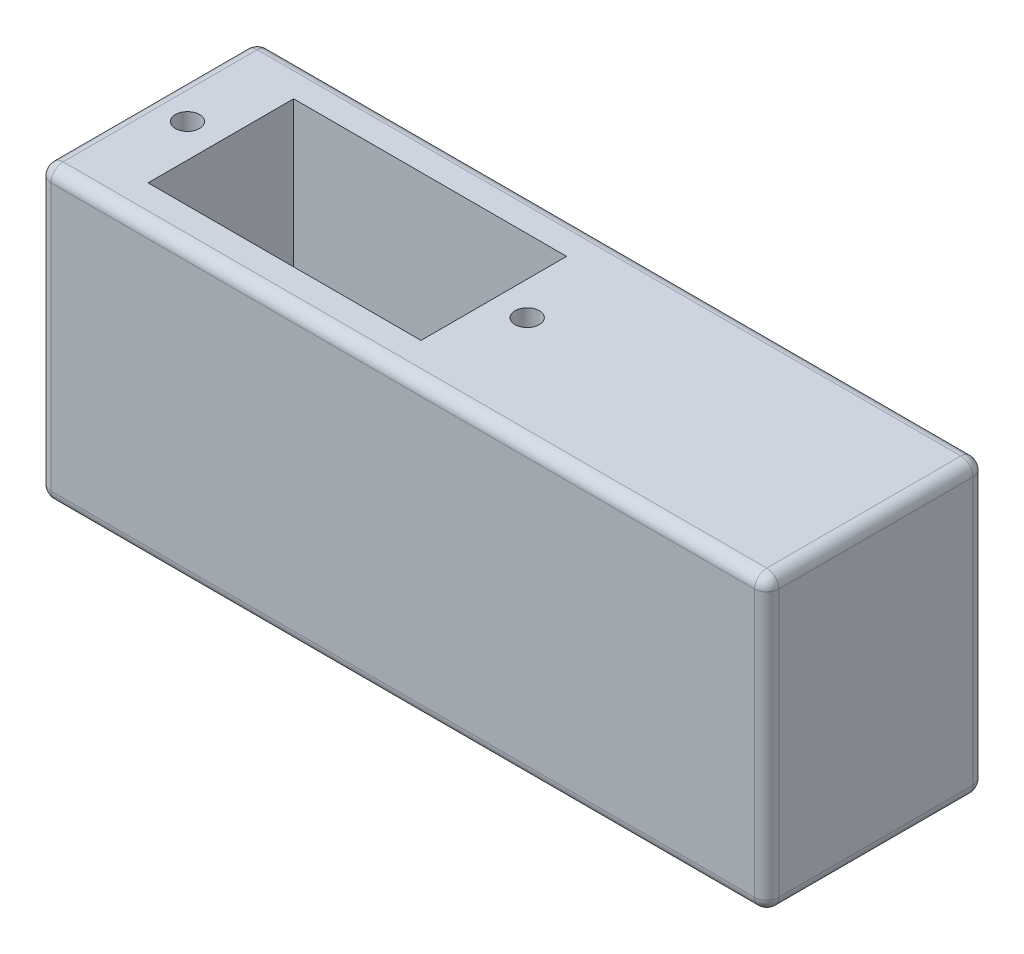
ISO-10303-21;
HEADER;
FILE_DESCRIPTION(('STEP AP214'),'2;1');
FILE_NAME('part.step','',(''),(''),'','','');
FILE_SCHEMA(('AUTOMOTIVE_DESIGN { 1 0 10303 214 1 1 1 1 }'));
ENDSEC;
DATA;
#1=APPLICATION_CONTEXT('core data for automotive mechanical design processes');
#2=APPLICATION_PROTOCOL_DEFINITION('international standard','automotive_design',2000,#1);
#3=PRODUCT_CONTEXT('',#1,'mechanical');
#4=PRODUCT('Part','Part','',(#3));
#5=PRODUCT_RELATED_PRODUCT_CATEGORY('part','',(#4));
#6=PRODUCT_DEFINITION_FORMATION('','',#4);
#7=PRODUCT_DEFINITION_CONTEXT('part definition',#1,'design');
#8=PRODUCT_DEFINITION('design','',#6,#7);
#9=PRODUCT_DEFINITION_SHAPE('','',#8);
#10=(LENGTH_UNIT() NAMED_UNIT(*) SI_UNIT(.MILLI.,.METRE.));
#11=(NAMED_UNIT(*) PLANE_ANGLE_UNIT() SI_UNIT($,.RADIAN.));
#12=(NAMED_UNIT(*) SI_UNIT($,.STERADIAN.) SOLID_ANGLE_UNIT());
#13=UNCERTAINTY_MEASURE_WITH_UNIT(LENGTH_MEASURE(1.E-05),#10,'distance_accuracy_value','');
#14=(GEOMETRIC_REPRESENTATION_CONTEXT(3) GLOBAL_UNCERTAINTY_ASSIGNED_CONTEXT((#13)) GLOBAL_UNIT_ASSIGNED_CONTEXT((#10,
#11,#12)) REPRESENTATION_CONTEXT('',''));
#15=CARTESIAN_POINT('',(0.,0.,0.));
#16=DIRECTION('',(0.,0.,1.));
#17=DIRECTION('',(1.,0.,0.));
#18=AXIS2_PLACEMENT_3D('',#15,#16,#17);
#19=CARTESIAN_POINT('',(0.,21.,0.));
#20=DIRECTION('',(0.,-1.,0.));
#21=DIRECTION('',(0.,0.,-1.));
#22=AXIS2_PLACEMENT_3D('',#19,#20,#21);
#23=PLANE('',#22);
#24=DIRECTION('',(1.,0.,0.));
#25=VECTOR('',#24,1.);
#26=CARTESIAN_POINT('',(0.,21.,8.));
#27=LINE('',#26,#25);
#28=CARTESIAN_POINT('',(-29.,21.,8.));
#29=VERTEX_POINT('',#28);
#30=CARTESIAN_POINT('',(29.,21.,8.));
#31=VERTEX_POINT('',#30);
#32=EDGE_CURVE('E240',#29,#31,#27,.T.);
#33=ORIENTED_EDGE('',*,*,#32,.T.);
#34=DIRECTION('',(0.,0.,-1.));
#35=VECTOR('',#34,1.);
#36=CARTESIAN_POINT('',(29.,21.,0.));
#37=LINE('',#36,#35);
#38=CARTESIAN_POINT('',(29.,21.,-8.));
#39=VERTEX_POINT('',#38);
#40=EDGE_CURVE('E242',#31,#39,#37,.T.);
#41=ORIENTED_EDGE('',*,*,#40,.T.);
#42=DIRECTION('',(-1.,0.,0.));
#43=VECTOR('',#42,1.);
#44=CARTESIAN_POINT('',(0.,21.,-8.));
#45=LINE('',#44,#43);
#46=CARTESIAN_POINT('',(-29.,21.,-8.));
#47=VERTEX_POINT('',#46);
#48=EDGE_CURVE('E236',#39,#47,#45,.T.);
#49=ORIENTED_EDGE('',*,*,#48,.T.);
#50=DIRECTION('',(0.,0.,1.));
#51=VECTOR('',#50,1.);
#52=CARTESIAN_POINT('',(-29.,21.,0.));
#53=LINE('',#52,#51);
#54=EDGE_CURVE('E238',#47,#29,#53,.T.);
#55=ORIENTED_EDGE('',*,*,#54,.T.);
#56=EDGE_LOOP('',(#33,#41,#49,#55));
#57=FACE_BOUND('',#56,.T.);
#58=CARTESIAN_POINT('',(1.24999999999999,21.,0.));
#59=DIRECTION('',(0.,1.,0.));
#60=DIRECTION('',(0.,0.,1.));
#61=AXIS2_PLACEMENT_3D('',#58,#59,#60);
#62=CIRCLE('',#61,1.);
#63=CARTESIAN_POINT('',(1.24999999999999,21.,0.999999999999997));
#64=VERTEX_POINT('',#63);
#65=EDGE_CURVE('E373',#64,#64,#62,.T.);
#66=ORIENTED_EDGE('',*,*,#65,.F.);
#67=EDGE_LOOP('',(#66));
#68=FACE_BOUND('',#67,.T.);
#69=CARTESIAN_POINT('',(-26.75,21.,0.));
#70=DIRECTION('',(0.,1.,0.));
#71=DIRECTION('',(0.,0.,1.));
#72=AXIS2_PLACEMENT_3D('',#69,#70,#71);
#73=CIRCLE('',#72,1.);
#74=CARTESIAN_POINT('',(-26.75,21.,1.));
#75=VERTEX_POINT('',#74);
#76=EDGE_CURVE('E438',#75,#75,#73,.T.);
#77=ORIENTED_EDGE('',*,*,#76,.F.);
#78=EDGE_LOOP('',(#77));
#79=FACE_BOUND('',#78,.T.);
#80=DIRECTION('',(0.,0.,1.));
#81=VECTOR('',#80,1.);
#82=CARTESIAN_POINT('',(-24.,21.,6.));
#83=LINE('',#82,#81);
#84=CARTESIAN_POINT('',(-24.,21.,-6.));
#85=VERTEX_POINT('',#84);
#86=CARTESIAN_POINT('',(-24.,21.,6.));
#87=VERTEX_POINT('',#86);
#88=EDGE_CURVE('E226',#85,#87,#83,.T.);
#89=ORIENTED_EDGE('',*,*,#88,.F.);
#90=DIRECTION('',(-1.,0.,0.));
#91=VECTOR('',#90,1.);
#92=CARTESIAN_POINT('',(-24.,21.,-6.));
#93=LINE('',#92,#91);
#94=CARTESIAN_POINT('',(-1.50000000000001,21.,-6.));
#95=VERTEX_POINT('',#94);
#96=EDGE_CURVE('E221',#95,#85,#93,.T.);
#97=ORIENTED_EDGE('',*,*,#96,.F.);
#98=DIRECTION('',(0.,0.,-1.));
#99=VECTOR('',#98,1.);
#100=CARTESIAN_POINT('',(-1.50000000000001,21.,6.));
#101=LINE('',#100,#99);
#102=CARTESIAN_POINT('',(-1.50000000000001,21.,6.));
#103=VERTEX_POINT('',#102);
#104=EDGE_CURVE('E415',#103,#95,#101,.T.);
#105=ORIENTED_EDGE('',*,*,#104,.F.);
#106=DIRECTION('',(1.,0.,0.));
#107=VECTOR('',#106,1.);
#108=CARTESIAN_POINT('',(-24.,21.,6.));
#109=LINE('',#108,#107);
#110=EDGE_CURVE('E414',#87,#103,#109,.T.);
#111=ORIENTED_EDGE('',*,*,#110,.F.);
#112=EDGE_LOOP('',(#89,#97,#105,#111));
#113=FACE_BOUND('',#112,.T.);
#114=ADVANCED_FACE('F35',(#57,#68,#79,#113),#23,.F.);
#115=CARTESIAN_POINT('',(30.,21.,9.));
#116=DIRECTION('',(-1.,0.,0.));
#117=DIRECTION('',(0.,0.,1.));
#118=AXIS2_PLACEMENT_3D('',#115,#116,#117);
#119=PLANE('',#118);
#120=DIRECTION('',(0.,0.,-1.));
#121=VECTOR('',#120,1.);
#122=CARTESIAN_POINT('',(30.,20.,9.));
#123=LINE('',#122,#121);
#124=CARTESIAN_POINT('',(30.,20.,-8.));
#125=VERTEX_POINT('',#124);
#126=CARTESIAN_POINT('',(30.,20.,8.));
#127=VERTEX_POINT('',#126);
#128=EDGE_CURVE('E249',#125,#127,#123,.F.);
#129=ORIENTED_EDGE('',*,*,#128,.T.);
#130=DIRECTION('',(0.,-1.,0.));
#131=VECTOR('',#130,1.);
#132=CARTESIAN_POINT('',(30.,21.,8.));
#133=LINE('',#132,#131);
#134=CARTESIAN_POINT('',(30.,-2.,8.));
#135=VERTEX_POINT('',#134);
#136=EDGE_CURVE('E252',#127,#135,#133,.T.);
#137=ORIENTED_EDGE('',*,*,#136,.T.);
#138=DIRECTION('',(0.,0.,1.));
#139=VECTOR('',#138,1.);
#140=CARTESIAN_POINT('',(30.,-2.,-9.));
#141=LINE('',#140,#139);
#142=CARTESIAN_POINT('',(30.,-2.,-8.));
#143=VERTEX_POINT('',#142);
#144=EDGE_CURVE('E247',#135,#143,#141,.F.);
#145=ORIENTED_EDGE('',*,*,#144,.T.);
#146=DIRECTION('',(0.,-1.,0.));
#147=VECTOR('',#146,1.);
#148=CARTESIAN_POINT('',(30.,21.,-8.));
#149=LINE('',#148,#147);
#150=EDGE_CURVE('E245',#143,#125,#149,.F.);
#151=ORIENTED_EDGE('',*,*,#150,.T.);
#152=EDGE_LOOP('',(#129,#137,#145,#151));
#153=FACE_BOUND('',#152,.T.);
#154=ADVANCED_FACE('F460',(#153),#119,.F.);
#155=CARTESIAN_POINT('',(-30.,21.,-9.));
#156=DIRECTION('',(0.,0.,1.));
#157=DIRECTION('',(1.,0.,0.));
#158=AXIS2_PLACEMENT_3D('',#155,#156,#157);
#159=PLANE('',#158);
#160=DIRECTION('',(0.,-1.,0.));
#161=VECTOR('',#160,1.);
#162=CARTESIAN_POINT('',(-29.,21.,-9.));
#163=LINE('',#162,#161);
#164=CARTESIAN_POINT('',(-29.,-2.,-9.));
#165=VERTEX_POINT('',#164);
#166=CARTESIAN_POINT('',(-29.,20.,-9.));
#167=VERTEX_POINT('',#166);
#168=EDGE_CURVE('E44',#165,#167,#163,.F.);
#169=ORIENTED_EDGE('',*,*,#168,.T.);
#170=DIRECTION('',(-1.,0.,0.));
#171=VECTOR('',#170,1.);
#172=CARTESIAN_POINT('',(-30.,20.,-9.));
#173=LINE('',#172,#171);
#174=CARTESIAN_POINT('',(29.,20.,-9.));
#175=VERTEX_POINT('',#174);
#176=EDGE_CURVE('E11',#167,#175,#173,.F.);
#177=ORIENTED_EDGE('',*,*,#176,.T.);
#178=DIRECTION('',(0.,-1.,0.));
#179=VECTOR('',#178,1.);
#180=CARTESIAN_POINT('',(29.,21.,-9.));
#181=LINE('',#180,#179);
#182=CARTESIAN_POINT('',(29.,-2.,-9.));
#183=VERTEX_POINT('',#182);
#184=EDGE_CURVE('E304',#175,#183,#181,.T.);
#185=ORIENTED_EDGE('',*,*,#184,.T.);
#186=DIRECTION('',(1.,0.,0.));
#187=VECTOR('',#186,1.);
#188=CARTESIAN_POINT('',(-30.,-2.,-9.));
#189=LINE('',#188,#187);
#190=EDGE_CURVE('E55',#183,#165,#189,.F.);
#191=ORIENTED_EDGE('',*,*,#190,.T.);
#192=EDGE_LOOP('',(#169,#177,#185,#191));
#193=FACE_BOUND('',#192,.T.);
#194=ADVANCED_FACE('F510',(#193),#159,.F.);
#195=CARTESIAN_POINT('',(-30.,21.,9.));
#196=DIRECTION('',(1.,0.,0.));
#197=DIRECTION('',(0.,0.,-1.));
#198=AXIS2_PLACEMENT_3D('',#195,#196,#197);
#199=PLANE('',#198);
#200=DIRECTION('',(0.,0.,-1.));
#201=VECTOR('',#200,1.);
#202=CARTESIAN_POINT('',(-30.,4.,9.));
#203=LINE('',#202,#201);
#204=CARTESIAN_POINT('',(-30.,4.,-4.));
#205=VERTEX_POINT('',#204);
#206=CARTESIAN_POINT('',(-30.,4.,4.));
#207=VERTEX_POINT('',#206);
#208=EDGE_CURVE('E291',#205,#207,#203,.F.);
#209=ORIENTED_EDGE('',*,*,#208,.T.);
#210=DIRECTION('',(0.,1.,0.));
#211=VECTOR('',#210,1.);
#212=CARTESIAN_POINT('',(-30.,21.,3.99999999999999));
#213=LINE('',#212,#211);
#214=CARTESIAN_POINT('',(-30.,-1.,4.));
#215=VERTEX_POINT('',#214);
#216=EDGE_CURVE('E293',#207,#215,#213,.F.);
#217=ORIENTED_EDGE('',*,*,#216,.T.);
#218=DIRECTION('',(0.,0.,1.));
#219=VECTOR('',#218,1.);
#220=CARTESIAN_POINT('',(-30.,-1.,9.));
#221=LINE('',#220,#219);
#222=CARTESIAN_POINT('',(-30.,-1.,-4.));
#223=VERTEX_POINT('',#222);
#224=EDGE_CURVE('E287',#215,#223,#221,.F.);
#225=ORIENTED_EDGE('',*,*,#224,.T.);
#226=DIRECTION('',(0.,-1.,0.));
#227=VECTOR('',#226,1.);
#228=CARTESIAN_POINT('',(-30.,21.,-4.));
#229=LINE('',#228,#227);
#230=EDGE_CURVE('E289',#223,#205,#229,.F.);
#231=ORIENTED_EDGE('',*,*,#230,.T.);
#232=EDGE_LOOP('',(#209,#217,#225,#231));
#233=FACE_BOUND('',#232,.T.);
#234=DIRECTION('',(0.,-1.,0.));
#235=VECTOR('',#234,1.);
#236=CARTESIAN_POINT('',(-30.,21.,8.));
#237=LINE('',#236,#235);
#238=CARTESIAN_POINT('',(-30.,-2.,8.));
#239=VERTEX_POINT('',#238);
#240=CARTESIAN_POINT('',(-30.,20.,8.));
#241=VERTEX_POINT('',#240);
#242=EDGE_CURVE('E282',#239,#241,#237,.F.);
#243=ORIENTED_EDGE('',*,*,#242,.T.);
#244=DIRECTION('',(0.,0.,1.));
#245=VECTOR('',#244,1.);
#246=CARTESIAN_POINT('',(-30.,20.,9.));
#247=LINE('',#246,#245);
#248=CARTESIAN_POINT('',(-30.,20.,-8.));
#249=VERTEX_POINT('',#248);
#250=EDGE_CURVE('E284',#241,#249,#247,.F.);
#251=ORIENTED_EDGE('',*,*,#250,.T.);
#252=DIRECTION('',(0.,-1.,0.));
#253=VECTOR('',#252,1.);
#254=CARTESIAN_POINT('',(-30.,21.,-8.));
#255=LINE('',#254,#253);
#256=CARTESIAN_POINT('',(-30.,-2.,-8.));
#257=VERTEX_POINT('',#256);
#258=EDGE_CURVE('E278',#249,#257,#255,.T.);
#259=ORIENTED_EDGE('',*,*,#258,.T.);
#260=DIRECTION('',(0.,0.,-1.));
#261=VECTOR('',#260,1.);
#262=CARTESIAN_POINT('',(-30.,-2.,9.));
#263=LINE('',#262,#261);
#264=EDGE_CURVE('E280',#257,#239,#263,.F.);
#265=ORIENTED_EDGE('',*,*,#264,.T.);
#266=EDGE_LOOP('',(#243,#251,#259,#265));
#267=FACE_BOUND('',#266,.T.);
#268=ADVANCED_FACE('F392',(#233,#267),#199,.F.);
#269=CARTESIAN_POINT('',(-30.,21.,9.));
#270=DIRECTION('',(0.,0.,-1.));
#271=DIRECTION('',(-1.,0.,0.));
#272=AXIS2_PLACEMENT_3D('',#269,#270,#271);
#273=PLANE('',#272);
#274=DIRECTION('',(0.,-1.,0.));
#275=VECTOR('',#274,1.);
#276=CARTESIAN_POINT('',(29.,21.,9.));
#277=LINE('',#276,#275);
#278=CARTESIAN_POINT('',(29.,-2.,9.));
#279=VERTEX_POINT('',#278);
#280=CARTESIAN_POINT('',(29.,20.,9.));
#281=VERTEX_POINT('',#280);
#282=EDGE_CURVE('E273',#279,#281,#277,.F.);
#283=ORIENTED_EDGE('',*,*,#282,.T.);
#284=DIRECTION('',(1.,0.,0.));
#285=VECTOR('',#284,1.);
#286=CARTESIAN_POINT('',(-30.,20.,9.));
#287=LINE('',#286,#285);
#288=CARTESIAN_POINT('',(-29.,20.,9.));
#289=VERTEX_POINT('',#288);
#290=EDGE_CURVE('E275',#281,#289,#287,.F.);
#291=ORIENTED_EDGE('',*,*,#290,.T.);
#292=DIRECTION('',(0.,-1.,0.));
#293=VECTOR('',#292,1.);
#294=CARTESIAN_POINT('',(-29.,21.,9.));
#295=LINE('',#294,#293);
#296=CARTESIAN_POINT('',(-29.,-2.,9.));
#297=VERTEX_POINT('',#296);
#298=EDGE_CURVE('E269',#289,#297,#295,.T.);
#299=ORIENTED_EDGE('',*,*,#298,.T.);
#300=DIRECTION('',(-1.,0.,0.));
#301=VECTOR('',#300,1.);
#302=CARTESIAN_POINT('',(30.,-2.,9.));
#303=LINE('',#302,#301);
#304=EDGE_CURVE('E271',#297,#279,#303,.F.);
#305=ORIENTED_EDGE('',*,*,#304,.T.);
#306=EDGE_LOOP('',(#283,#291,#299,#305));
#307=FACE_BOUND('',#306,.T.);
#308=ADVANCED_FACE('F503',(#307),#273,.F.);
#309=CARTESIAN_POINT('',(-24.,21.,6.));
#310=DIRECTION('',(1.,0.,0.));
#311=DIRECTION('',(0.,0.,-1.));
#312=AXIS2_PLACEMENT_3D('',#309,#310,#311);
#313=PLANE('',#312);
#314=DIRECTION('',(0.,-1.,0.));
#315=VECTOR('',#314,1.);
#316=CARTESIAN_POINT('',(-24.,0.,-3.));
#317=LINE('',#316,#315);
#318=CARTESIAN_POINT('',(-24.,3.,-3.));
#319=VERTEX_POINT('',#318);
#320=CARTESIAN_POINT('',(-24.,0.,-3.));
#321=VERTEX_POINT('',#320);
#322=EDGE_CURVE('E188',#319,#321,#317,.T.);
#323=ORIENTED_EDGE('',*,*,#322,.T.);
#324=DIRECTION('',(0.,0.,1.));
#325=VECTOR('',#324,1.);
#326=CARTESIAN_POINT('',(-24.,0.,6.));
#327=LINE('',#326,#325);
#328=CARTESIAN_POINT('',(-24.,0.,-6.));
#329=VERTEX_POINT('',#328);
#330=EDGE_CURVE('E202',#329,#321,#327,.T.);
#331=ORIENTED_EDGE('',*,*,#330,.F.);
#332=DIRECTION('',(0.,-1.,0.));
#333=VECTOR('',#332,1.);
#334=CARTESIAN_POINT('',(-24.,21.,-6.));
#335=LINE('',#334,#333);
#336=EDGE_CURVE('E227',#85,#329,#335,.T.);
#337=ORIENTED_EDGE('',*,*,#336,.F.);
#338=ORIENTED_EDGE('',*,*,#88,.T.);
#339=DIRECTION('',(0.,-1.,0.));
#340=VECTOR('',#339,1.);
#341=CARTESIAN_POINT('',(-24.,21.,6.));
#342=LINE('',#341,#340);
#343=CARTESIAN_POINT('',(-24.,0.,6.));
#344=VERTEX_POINT('',#343);
#345=EDGE_CURVE('E233',#87,#344,#342,.T.);
#346=ORIENTED_EDGE('',*,*,#345,.T.);
#347=CARTESIAN_POINT('',(-24.,0.,3.));
#348=VERTEX_POINT('',#347);
#349=EDGE_CURVE('E214',#348,#344,#327,.T.);
#350=ORIENTED_EDGE('',*,*,#349,.F.);
#351=DIRECTION('',(0.,1.,0.));
#352=VECTOR('',#351,1.);
#353=CARTESIAN_POINT('',(-24.,0.,3.));
#354=LINE('',#353,#352);
#355=CARTESIAN_POINT('',(-24.,3.,3.));
#356=VERTEX_POINT('',#355);
#357=EDGE_CURVE('E206',#348,#356,#354,.T.);
#358=ORIENTED_EDGE('',*,*,#357,.T.);
#359=DIRECTION('',(0.,0.,-1.));
#360=VECTOR('',#359,1.);
#361=CARTESIAN_POINT('',(-24.,3.,-3.));
#362=LINE('',#361,#360);
#363=EDGE_CURVE('E196',#356,#319,#362,.T.);
#364=ORIENTED_EDGE('',*,*,#363,.T.);
#365=EDGE_LOOP('',(#323,#331,#337,#338,#346,#350,#358,#364));
#366=FACE_BOUND('',#365,.T.);
#367=ADVANCED_FACE('F200',(#366),#313,.T.);
#368=CARTESIAN_POINT('',(-24.,21.,6.));
#369=DIRECTION('',(0.,0.,-1.));
#370=DIRECTION('',(-1.,0.,0.));
#371=AXIS2_PLACEMENT_3D('',#368,#369,#370);
#372=PLANE('',#371);
#373=DIRECTION('',(1.,0.,0.));
#374=VECTOR('',#373,1.);
#375=CARTESIAN_POINT('',(-24.,0.,6.));
#376=LINE('',#375,#374);
#377=CARTESIAN_POINT('',(-1.50000000000001,0.,6.));
#378=VERTEX_POINT('',#377);
#379=EDGE_CURVE('E213',#344,#378,#376,.T.);
#380=ORIENTED_EDGE('',*,*,#379,.F.);
#381=ORIENTED_EDGE('',*,*,#345,.F.);
#382=ORIENTED_EDGE('',*,*,#110,.T.);
#383=DIRECTION('',(0.,-1.,0.));
#384=VECTOR('',#383,1.);
#385=CARTESIAN_POINT('',(-1.50000000000001,21.,6.));
#386=LINE('',#385,#384);
#387=EDGE_CURVE('E231',#103,#378,#386,.T.);
#388=ORIENTED_EDGE('',*,*,#387,.T.);
#389=EDGE_LOOP('',(#380,#381,#382,#388));
#390=FACE_BOUND('',#389,.T.);
#391=ADVANCED_FACE('F429',(#390),#372,.T.);
#392=CARTESIAN_POINT('',(-1.50000000000001,21.,6.));
#393=DIRECTION('',(-1.,0.,0.));
#394=DIRECTION('',(0.,0.,1.));
#395=AXIS2_PLACEMENT_3D('',#392,#393,#394);
#396=PLANE('',#395);
#397=DIRECTION('',(0.,0.,-1.));
#398=VECTOR('',#397,1.);
#399=CARTESIAN_POINT('',(-1.50000000000001,0.,6.));
#400=LINE('',#399,#398);
#401=CARTESIAN_POINT('',(-1.50000000000001,0.,-6.));
#402=VERTEX_POINT('',#401);
#403=EDGE_CURVE('E217',#378,#402,#400,.T.);
#404=ORIENTED_EDGE('',*,*,#403,.F.);
#405=ORIENTED_EDGE('',*,*,#387,.F.);
#406=ORIENTED_EDGE('',*,*,#104,.T.);
#407=DIRECTION('',(0.,-1.,0.));
#408=VECTOR('',#407,1.);
#409=CARTESIAN_POINT('',(-1.50000000000001,21.,-6.));
#410=LINE('',#409,#408);
#411=EDGE_CURVE('E229',#95,#402,#410,.T.);
#412=ORIENTED_EDGE('',*,*,#411,.T.);
#413=EDGE_LOOP('',(#404,#405,#406,#412));
#414=FACE_BOUND('',#413,.T.);
#415=ADVANCED_FACE('F431',(#414),#396,.T.);
#416=CARTESIAN_POINT('',(-24.,21.,-6.));
#417=DIRECTION('',(0.,0.,1.));
#418=DIRECTION('',(1.,0.,0.));
#419=AXIS2_PLACEMENT_3D('',#416,#417,#418);
#420=PLANE('',#419);
#421=DIRECTION('',(-1.,0.,0.));
#422=VECTOR('',#421,1.);
#423=CARTESIAN_POINT('',(-24.,0.,-6.));
#424=LINE('',#423,#422);
#425=EDGE_CURVE('E212',#402,#329,#424,.T.);
#426=ORIENTED_EDGE('',*,*,#425,.F.);
#427=ORIENTED_EDGE('',*,*,#411,.F.);
#428=ORIENTED_EDGE('',*,*,#96,.T.);
#429=ORIENTED_EDGE('',*,*,#336,.T.);
#430=EDGE_LOOP('',(#426,#427,#428,#429));
#431=FACE_BOUND('',#430,.T.);
#432=ADVANCED_FACE('F422',(#431),#420,.T.);
#433=CARTESIAN_POINT('',(0.,0.,0.));
#434=DIRECTION('',(0.,-1.,0.));
#435=DIRECTION('',(0.,0.,-1.));
#436=AXIS2_PLACEMENT_3D('',#433,#434,#435);
#437=PLANE('',#436);
#438=DIRECTION('',(-1.,0.,0.));
#439=VECTOR('',#438,1.);
#440=CARTESIAN_POINT('',(-24.,0.,-3.));
#441=LINE('',#440,#439);
#442=CARTESIAN_POINT('',(-29.,0.,-3.));
#443=VERTEX_POINT('',#442);
#444=EDGE_CURVE('E184',#321,#443,#441,.T.);
#445=ORIENTED_EDGE('',*,*,#444,.T.);
#446=DIRECTION('',(0.,0.,1.));
#447=VECTOR('',#446,1.);
#448=CARTESIAN_POINT('',(-29.,0.,0.));
#449=LINE('',#448,#447);
#450=CARTESIAN_POINT('',(-29.,0.,3.));
#451=VERTEX_POINT('',#450);
#452=EDGE_CURVE('E302',#443,#451,#449,.T.);
#453=ORIENTED_EDGE('',*,*,#452,.T.);
#454=DIRECTION('',(-1.,0.,0.));
#455=VECTOR('',#454,1.);
#456=CARTESIAN_POINT('',(-24.,0.,3.));
#457=LINE('',#456,#455);
#458=EDGE_CURVE('E195',#348,#451,#457,.T.);
#459=ORIENTED_EDGE('',*,*,#458,.F.);
#460=ORIENTED_EDGE('',*,*,#349,.T.);
#461=ORIENTED_EDGE('',*,*,#379,.T.);
#462=ORIENTED_EDGE('',*,*,#403,.T.);
#463=ORIENTED_EDGE('',*,*,#425,.T.);
#464=ORIENTED_EDGE('',*,*,#330,.T.);
#465=EDGE_LOOP('',(#445,#453,#459,#460,#461,#462,#463,#464));
#466=FACE_BOUND('',#465,.T.);
#467=ADVANCED_FACE('F209',(#466),#437,.F.);
#468=CARTESIAN_POINT('',(0.,-3.,0.));
#469=DIRECTION('',(0.,-1.,0.));
#470=DIRECTION('',(0.,0.,-1.));
#471=AXIS2_PLACEMENT_3D('',#468,#469,#470);
#472=PLANE('',#471);
#473=CARTESIAN_POINT('',(-18.,-3.,0.));
#474=DIRECTION('',(0.,-1.,0.));
#475=DIRECTION('',(0.,0.,-1.));
#476=AXIS2_PLACEMENT_3D('',#473,#474,#475);
#477=CIRCLE('',#476,3.75);
#478=CARTESIAN_POINT('',(-18.,-3.,-3.75));
#479=VERTEX_POINT('',#478);
#480=EDGE_CURVE('E263',#479,#479,#477,.F.);
#481=ORIENTED_EDGE('',*,*,#480,.T.);
#482=EDGE_LOOP('',(#481));
#483=FACE_BOUND('',#482,.T.);
#484=DIRECTION('',(1.,0.,0.));
#485=VECTOR('',#484,1.);
#486=CARTESIAN_POINT('',(30.,-3.,-8.));
#487=LINE('',#486,#485);
#488=CARTESIAN_POINT('',(-29.,-3.,-8.));
#489=VERTEX_POINT('',#488);
#490=CARTESIAN_POINT('',(29.,-3.,-8.));
#491=VERTEX_POINT('',#490);
#492=EDGE_CURVE('E254',#489,#491,#487,.T.);
#493=ORIENTED_EDGE('',*,*,#492,.T.);
#494=DIRECTION('',(0.,0.,1.));
#495=VECTOR('',#494,1.);
#496=CARTESIAN_POINT('',(29.,-3.,9.));
#497=LINE('',#496,#495);
#498=CARTESIAN_POINT('',(29.,-3.,8.));
#499=VERTEX_POINT('',#498);
#500=EDGE_CURVE('E260',#491,#499,#497,.T.);
#501=ORIENTED_EDGE('',*,*,#500,.T.);
#502=DIRECTION('',(-1.,0.,0.));
#503=VECTOR('',#502,1.);
#504=CARTESIAN_POINT('',(-30.,-3.,8.));
#505=LINE('',#504,#503);
#506=CARTESIAN_POINT('',(-29.,-3.,8.));
#507=VERTEX_POINT('',#506);
#508=EDGE_CURVE('E258',#499,#507,#505,.T.);
#509=ORIENTED_EDGE('',*,*,#508,.T.);
#510=DIRECTION('',(0.,0.,-1.));
#511=VECTOR('',#510,1.);
#512=CARTESIAN_POINT('',(-29.,-3.,-9.));
#513=LINE('',#512,#511);
#514=EDGE_CURVE('E256',#507,#489,#513,.T.);
#515=ORIENTED_EDGE('',*,*,#514,.T.);
#516=EDGE_LOOP('',(#493,#501,#509,#515));
#517=FACE_BOUND('',#516,.T.);
#518=ADVANCED_FACE('F490',(#483,#517),#472,.T.);
#519=CARTESIAN_POINT('',(-24.,0.,-3.));
#520=DIRECTION('',(0.,0.,-1.));
#521=DIRECTION('',(-1.,0.,0.));
#522=AXIS2_PLACEMENT_3D('',#519,#520,#521);
#523=PLANE('',#522);
#524=DIRECTION('',(-1.,0.,0.));
#525=VECTOR('',#524,1.);
#526=CARTESIAN_POINT('',(-24.,3.,-3.));
#527=LINE('',#526,#525);
#528=CARTESIAN_POINT('',(-29.,3.,-3.));
#529=VERTEX_POINT('',#528);
#530=EDGE_CURVE('E219',#319,#529,#527,.T.);
#531=ORIENTED_EDGE('',*,*,#530,.T.);
#532=DIRECTION('',(0.,-1.,0.));
#533=VECTOR('',#532,1.);
#534=CARTESIAN_POINT('',(-29.,0.,-3.));
#535=LINE('',#534,#533);
#536=EDGE_CURVE('E191',#529,#443,#535,.T.);
#537=ORIENTED_EDGE('',*,*,#536,.T.);
#538=ORIENTED_EDGE('',*,*,#444,.F.);
#539=ORIENTED_EDGE('',*,*,#322,.F.);
#540=EDGE_LOOP('',(#531,#537,#538,#539));
#541=FACE_BOUND('',#540,.T.);
#542=ADVANCED_FACE('F187',(#541),#523,.F.);
#543=CARTESIAN_POINT('',(-24.,3.,-3.));
#544=DIRECTION('',(0.,1.,0.));
#545=DIRECTION('',(0.,0.,1.));
#546=AXIS2_PLACEMENT_3D('',#543,#544,#545);
#547=PLANE('',#546);
#548=DIRECTION('',(-1.,0.,0.));
#549=VECTOR('',#548,1.);
#550=CARTESIAN_POINT('',(-24.,3.,3.));
#551=LINE('',#550,#549);
#552=CARTESIAN_POINT('',(-29.,3.,3.));
#553=VERTEX_POINT('',#552);
#554=EDGE_CURVE('E405',#356,#553,#551,.T.);
#555=ORIENTED_EDGE('',*,*,#554,.T.);
#556=DIRECTION('',(0.,0.,-1.));
#557=VECTOR('',#556,1.);
#558=CARTESIAN_POINT('',(-29.,3.,-3.));
#559=LINE('',#558,#557);
#560=EDGE_CURVE('E299',#553,#529,#559,.T.);
#561=ORIENTED_EDGE('',*,*,#560,.T.);
#562=ORIENTED_EDGE('',*,*,#530,.F.);
#563=ORIENTED_EDGE('',*,*,#363,.F.);
#564=EDGE_LOOP('',(#555,#561,#562,#563));
#565=FACE_BOUND('',#564,.T.);
#566=ADVANCED_FACE('F407',(#565),#547,.F.);
#567=CARTESIAN_POINT('',(-24.,0.,3.));
#568=DIRECTION('',(0.,0.,1.));
#569=DIRECTION('',(0.,-1.,0.));
#570=AXIS2_PLACEMENT_3D('',#567,#568,#569);
#571=PLANE('',#570);
#572=ORIENTED_EDGE('',*,*,#458,.T.);
#573=DIRECTION('',(0.,1.,0.));
#574=VECTOR('',#573,1.);
#575=CARTESIAN_POINT('',(-29.,0.,3.));
#576=LINE('',#575,#574);
#577=EDGE_CURVE('E296',#451,#553,#576,.T.);
#578=ORIENTED_EDGE('',*,*,#577,.T.);
#579=ORIENTED_EDGE('',*,*,#554,.F.);
#580=ORIENTED_EDGE('',*,*,#357,.F.);
#581=EDGE_LOOP('',(#572,#578,#579,#580));
#582=FACE_BOUND('',#581,.T.);
#583=ADVANCED_FACE('F404',(#582),#571,.F.);
#584=CARTESIAN_POINT('',(-18.,-8.,0.));
#585=DIRECTION('',(0.,1.,0.));
#586=DIRECTION('',(0.,0.,1.));
#587=AXIS2_PLACEMENT_3D('',#584,#585,#586);
#588=CYLINDRICAL_SURFACE('',#587,2.75);
#589=CARTESIAN_POINT('',(-18.,-4.,0.));
#590=DIRECTION('',(0.,-1.,0.));
#591=DIRECTION('',(0.,0.,-1.));
#592=AXIS2_PLACEMENT_3D('',#589,#590,#591);
#593=CIRCLE('',#592,2.75);
#594=CARTESIAN_POINT('',(-18.,-4.,-2.75));
#595=VERTEX_POINT('',#594);
#596=EDGE_CURVE('E266',#595,#595,#593,.T.);
#597=ORIENTED_EDGE('',*,*,#596,.T.);
#598=EDGE_LOOP('',(#597));
#599=FACE_BOUND('',#598,.T.);
#600=CARTESIAN_POINT('',(-18.,-8.,0.));
#601=DIRECTION('',(0.,-1.,0.));
#602=DIRECTION('',(0.,0.,-1.));
#603=AXIS2_PLACEMENT_3D('',#600,#601,#602);
#604=CIRCLE('',#603,2.75);
#605=CARTESIAN_POINT('',(-18.,-8.,-2.75));
#606=VERTEX_POINT('',#605);
#607=EDGE_CURVE('E207',#606,#606,#604,.T.);
#608=ORIENTED_EDGE('',*,*,#607,.F.);
#609=EDGE_LOOP('',(#608));
#610=FACE_BOUND('',#609,.T.);
#611=ADVANCED_FACE('F476',(#599,#610),#588,.T.);
#612=CARTESIAN_POINT('',(-18.,-8.,0.));
#613=DIRECTION('',(0.,-1.,0.));
#614=DIRECTION('',(0.,0.,-1.));
#615=AXIS2_PLACEMENT_3D('',#612,#613,#614);
#616=PLANE('',#615);
#617=ORIENTED_EDGE('',*,*,#607,.T.);
#618=EDGE_LOOP('',(#617));
#619=FACE_BOUND('',#618,.T.);
#620=ADVANCED_FACE('F467',(#619),#616,.T.);
#621=CARTESIAN_POINT('',(-26.75,16.,0.));
#622=DIRECTION('',(0.,1.,0.));
#623=DIRECTION('',(0.,0.,1.));
#624=AXIS2_PLACEMENT_3D('',#621,#622,#623);
#625=CYLINDRICAL_SURFACE('',#624,1.);
#626=CARTESIAN_POINT('',(-26.75,16.,0.));
#627=DIRECTION('',(0.,1.,0.));
#628=DIRECTION('',(0.,0.,1.));
#629=AXIS2_PLACEMENT_3D('',#626,#627,#628);
#630=CIRCLE('',#629,1.);
#631=CARTESIAN_POINT('',(-26.75,16.,1.));
#632=VERTEX_POINT('',#631);
#633=EDGE_CURVE('E437',#632,#632,#630,.T.);
#634=ORIENTED_EDGE('',*,*,#633,.F.);
#635=EDGE_LOOP('',(#634));
#636=FACE_BOUND('',#635,.T.);
#637=ORIENTED_EDGE('',*,*,#76,.T.);
#638=EDGE_LOOP('',(#637));
#639=FACE_BOUND('',#638,.T.);
#640=ADVANCED_FACE('F465',(#636,#639),#625,.F.);
#641=CARTESIAN_POINT('',(-26.75,16.,0.));
#642=DIRECTION('',(0.,1.,0.));
#643=DIRECTION('',(0.,0.,1.));
#644=AXIS2_PLACEMENT_3D('',#641,#642,#643);
#645=PLANE('',#644);
#646=ORIENTED_EDGE('',*,*,#633,.T.);
#647=EDGE_LOOP('',(#646));
#648=FACE_BOUND('',#647,.T.);
#649=ADVANCED_FACE('F454',(#648),#645,.T.);
#650=CARTESIAN_POINT('',(1.24999999999999,16.,0.));
#651=DIRECTION('',(0.,1.,0.));
#652=DIRECTION('',(0.,0.,1.));
#653=AXIS2_PLACEMENT_3D('',#650,#651,#652);
#654=CYLINDRICAL_SURFACE('',#653,1.);
#655=CARTESIAN_POINT('',(1.24999999999999,16.,0.));
#656=DIRECTION('',(0.,1.,0.));
#657=DIRECTION('',(0.,0.,1.));
#658=AXIS2_PLACEMENT_3D('',#655,#656,#657);
#659=CIRCLE('',#658,1.);
#660=CARTESIAN_POINT('',(1.24999999999999,16.,0.999999999999997));
#661=VERTEX_POINT('',#660);
#662=EDGE_CURVE('E441',#661,#661,#659,.T.);
#663=ORIENTED_EDGE('',*,*,#662,.F.);
#664=EDGE_LOOP('',(#663));
#665=FACE_BOUND('',#664,.T.);
#666=ORIENTED_EDGE('',*,*,#65,.T.);
#667=EDGE_LOOP('',(#666));
#668=FACE_BOUND('',#667,.T.);
#669=ADVANCED_FACE('F451',(#665,#668),#654,.F.);
#670=CARTESIAN_POINT('',(1.24999999999999,16.,0.));
#671=DIRECTION('',(0.,1.,0.));
#672=DIRECTION('',(0.,0.,1.));
#673=AXIS2_PLACEMENT_3D('',#670,#671,#672);
#674=PLANE('',#673);
#675=ORIENTED_EDGE('',*,*,#662,.T.);
#676=EDGE_LOOP('',(#675));
#677=FACE_BOUND('',#676,.T.);
#678=ADVANCED_FACE('F449',(#677),#674,.T.);
#679=CARTESIAN_POINT('',(-29.,-2.,0.));
#680=DIRECTION('',(0.,0.,1.));
#681=DIRECTION('',(1.,0.,0.));
#682=AXIS2_PLACEMENT_3D('',#679,#680,#681);
#683=CYLINDRICAL_SURFACE('',#682,1.);
#684=CARTESIAN_POINT('',(-29.,-2.,8.));
#685=DIRECTION('',(0.,0.,1.));
#686=DIRECTION('',(1.,0.,0.));
#687=AXIS2_PLACEMENT_3D('',#684,#685,#686);
#688=CIRCLE('',#687,1.);
#689=EDGE_CURVE('E370',#239,#507,#688,.T.);
#690=ORIENTED_EDGE('',*,*,#689,.F.);
#691=ORIENTED_EDGE('',*,*,#264,.F.);
#692=CARTESIAN_POINT('',(-29.,-2.,-8.));
#693=DIRECTION('',(0.,0.,-1.));
#694=DIRECTION('',(-1.,0.,0.));
#695=AXIS2_PLACEMENT_3D('',#692,#693,#694);
#696=CIRCLE('',#695,1.);
#697=EDGE_CURVE('E367',#489,#257,#696,.T.);
#698=ORIENTED_EDGE('',*,*,#697,.F.);
#699=ORIENTED_EDGE('',*,*,#514,.F.);
#700=EDGE_LOOP('',(#690,#691,#698,#699));
#701=FACE_BOUND('',#700,.T.);
#702=ADVANCED_FACE('F592',(#701),#683,.T.);
#703=CARTESIAN_POINT('',(-29.,-2.,8.));
#704=DIRECTION('',(0.,0.,1.));
#705=DIRECTION('',(1.,0.,0.));
#706=AXIS2_PLACEMENT_3D('',#703,#704,#705);
#707=SPHERICAL_SURFACE('',#706,1.);
#708=CARTESIAN_POINT('',(-29.,-2.,8.));
#709=DIRECTION('',(0.,-1.,0.));
#710=DIRECTION('',(0.,0.,-1.));
#711=AXIS2_PLACEMENT_3D('',#708,#709,#710);
#712=CIRCLE('',#711,1.);
#713=EDGE_CURVE('E361',#239,#297,#712,.F.);
#714=ORIENTED_EDGE('',*,*,#713,.F.);
#715=ORIENTED_EDGE('',*,*,#689,.T.);
#716=CARTESIAN_POINT('',(-29.,-2.,8.));
#717=DIRECTION('',(-1.,0.,0.));
#718=DIRECTION('',(0.,0.,1.));
#719=AXIS2_PLACEMENT_3D('',#716,#717,#718);
#720=CIRCLE('',#719,1.);
#721=EDGE_CURVE('E364',#297,#507,#720,.F.);
#722=ORIENTED_EDGE('',*,*,#721,.F.);
#723=EDGE_LOOP('',(#714,#715,#722));
#724=FACE_BOUND('',#723,.T.);
#725=ADVANCED_FACE('F588',(#724),#707,.T.);
#726=CARTESIAN_POINT('',(-29.,-2.,-8.));
#727=DIRECTION('',(0.,0.,1.));
#728=DIRECTION('',(1.,0.,0.));
#729=AXIS2_PLACEMENT_3D('',#726,#727,#728);
#730=SPHERICAL_SURFACE('',#729,1.);
#731=CARTESIAN_POINT('',(-29.,-2.,-8.));
#732=DIRECTION('',(-1.,0.,0.));
#733=DIRECTION('',(0.,0.,1.));
#734=AXIS2_PLACEMENT_3D('',#731,#732,#733);
#735=CIRCLE('',#734,1.);
#736=EDGE_CURVE('E356',#489,#165,#735,.F.);
#737=ORIENTED_EDGE('',*,*,#736,.F.);
#738=ORIENTED_EDGE('',*,*,#697,.T.);
#739=CARTESIAN_POINT('',(-29.,-2.,-8.));
#740=DIRECTION('',(0.,-1.,0.));
#741=DIRECTION('',(0.,0.,-1.));
#742=AXIS2_PLACEMENT_3D('',#739,#740,#741);
#743=CIRCLE('',#742,1.);
#744=EDGE_CURVE('E358',#165,#257,#743,.F.);
#745=ORIENTED_EDGE('',*,*,#744,.F.);
#746=EDGE_LOOP('',(#737,#738,#745));
#747=FACE_BOUND('',#746,.T.);
#748=ADVANCED_FACE('F584',(#747),#730,.T.);
#749=CARTESIAN_POINT('',(0.,-2.,8.));
#750=DIRECTION('',(1.,0.,0.));
#751=DIRECTION('',(0.,0.,-1.));
#752=AXIS2_PLACEMENT_3D('',#749,#750,#751);
#753=CYLINDRICAL_SURFACE('',#752,1.);
#754=ORIENTED_EDGE('',*,*,#721,.T.);
#755=ORIENTED_EDGE('',*,*,#508,.F.);
#756=CARTESIAN_POINT('',(29.,-2.,8.));
#757=DIRECTION('',(1.,0.,0.));
#758=DIRECTION('',(0.,0.,-1.));
#759=AXIS2_PLACEMENT_3D('',#756,#757,#758);
#760=CIRCLE('',#759,1.);
#761=EDGE_CURVE('E351',#279,#499,#760,.T.);
#762=ORIENTED_EDGE('',*,*,#761,.F.);
#763=ORIENTED_EDGE('',*,*,#304,.F.);
#764=EDGE_LOOP('',(#754,#755,#762,#763));
#765=FACE_BOUND('',#764,.T.);
#766=ADVANCED_FACE('F580',(#765),#753,.T.);
#767=CARTESIAN_POINT('',(-29.,21.,8.));
#768=DIRECTION('',(0.,-1.,0.));
#769=DIRECTION('',(0.,0.,-1.));
#770=AXIS2_PLACEMENT_3D('',#767,#768,#769);
#771=CYLINDRICAL_SURFACE('',#770,1.);
#772=ORIENTED_EDGE('',*,*,#713,.T.);
#773=ORIENTED_EDGE('',*,*,#298,.F.);
#774=CARTESIAN_POINT('',(-29.,20.,8.));
#775=DIRECTION('',(0.,1.,0.));
#776=DIRECTION('',(0.,0.,1.));
#777=AXIS2_PLACEMENT_3D('',#774,#775,#776);
#778=CIRCLE('',#777,1.);
#779=EDGE_CURVE('E348',#241,#289,#778,.T.);
#780=ORIENTED_EDGE('',*,*,#779,.F.);
#781=ORIENTED_EDGE('',*,*,#242,.F.);
#782=EDGE_LOOP('',(#772,#773,#780,#781));
#783=FACE_BOUND('',#782,.T.);
#784=ADVANCED_FACE('F576',(#783),#771,.T.);
#785=CARTESIAN_POINT('',(-29.,20.,0.));
#786=DIRECTION('',(0.,0.,1.));
#787=DIRECTION('',(1.,0.,0.));
#788=AXIS2_PLACEMENT_3D('',#785,#786,#787);
#789=CYLINDRICAL_SURFACE('',#788,1.);
#790=CARTESIAN_POINT('',(-29.,20.,-8.));
#791=DIRECTION('',(0.,0.,-1.));
#792=DIRECTION('',(0.,1.,0.));
#793=AXIS2_PLACEMENT_3D('',#790,#791,#792);
#794=CIRCLE('',#793,1.);
#795=EDGE_CURVE('E342',#249,#47,#794,.T.);
#796=ORIENTED_EDGE('',*,*,#795,.F.);
#797=ORIENTED_EDGE('',*,*,#250,.F.);
#798=CARTESIAN_POINT('',(-29.,20.,8.));
#799=DIRECTION('',(0.,0.,1.));
#800=DIRECTION('',(1.,0.,0.));
#801=AXIS2_PLACEMENT_3D('',#798,#799,#800);
#802=CIRCLE('',#801,1.);
#803=EDGE_CURVE('E345',#29,#241,#802,.T.);
#804=ORIENTED_EDGE('',*,*,#803,.F.);
#805=ORIENTED_EDGE('',*,*,#54,.F.);
#806=EDGE_LOOP('',(#796,#797,#804,#805));
#807=FACE_BOUND('',#806,.T.);
#808=ADVANCED_FACE('F572',(#807),#789,.T.);
#809=CARTESIAN_POINT('',(-29.,21.,-8.));
#810=DIRECTION('',(0.,-1.,0.));
#811=DIRECTION('',(0.,0.,-1.));
#812=AXIS2_PLACEMENT_3D('',#809,#810,#811);
#813=CYLINDRICAL_SURFACE('',#812,1.);
#814=ORIENTED_EDGE('',*,*,#744,.T.);
#815=ORIENTED_EDGE('',*,*,#258,.F.);
#816=CARTESIAN_POINT('',(-29.,20.,-8.));
#817=DIRECTION('',(0.,1.,0.));
#818=DIRECTION('',(0.,0.,1.));
#819=AXIS2_PLACEMENT_3D('',#816,#817,#818);
#820=CIRCLE('',#819,1.);
#821=EDGE_CURVE('E340',#167,#249,#820,.T.);
#822=ORIENTED_EDGE('',*,*,#821,.F.);
#823=ORIENTED_EDGE('',*,*,#168,.F.);
#824=EDGE_LOOP('',(#814,#815,#822,#823));
#825=FACE_BOUND('',#824,.T.);
#826=ADVANCED_FACE('F568',(#825),#813,.T.);
#827=CARTESIAN_POINT('',(0.,-2.,-8.));
#828=DIRECTION('',(-1.,0.,0.));
#829=DIRECTION('',(0.,0.,1.));
#830=AXIS2_PLACEMENT_3D('',#827,#828,#829);
#831=CYLINDRICAL_SURFACE('',#830,1.);
#832=ORIENTED_EDGE('',*,*,#736,.T.);
#833=ORIENTED_EDGE('',*,*,#190,.F.);
#834=CARTESIAN_POINT('',(29.,-2.,-8.));
#835=DIRECTION('',(1.,0.,0.));
#836=DIRECTION('',(0.,0.,-1.));
#837=AXIS2_PLACEMENT_3D('',#834,#835,#836);
#838=CIRCLE('',#837,1.);
#839=EDGE_CURVE('E337',#491,#183,#838,.T.);
#840=ORIENTED_EDGE('',*,*,#839,.F.);
#841=ORIENTED_EDGE('',*,*,#492,.F.);
#842=EDGE_LOOP('',(#832,#833,#840,#841));
#843=FACE_BOUND('',#842,.T.);
#844=ADVANCED_FACE('F564',(#843),#831,.T.);
#845=CARTESIAN_POINT('',(29.,-2.,0.));
#846=DIRECTION('',(0.,0.,-1.));
#847=DIRECTION('',(-1.,0.,0.));
#848=AXIS2_PLACEMENT_3D('',#845,#846,#847);
#849=CYLINDRICAL_SURFACE('',#848,1.);
#850=CARTESIAN_POINT('',(29.,-2.,8.));
#851=DIRECTION('',(0.,0.,1.));
#852=DIRECTION('',(1.,0.,0.));
#853=AXIS2_PLACEMENT_3D('',#850,#851,#852);
#854=CIRCLE('',#853,1.);
#855=EDGE_CURVE('E353',#499,#135,#854,.T.);
#856=ORIENTED_EDGE('',*,*,#855,.F.);
#857=ORIENTED_EDGE('',*,*,#500,.F.);
#858=CARTESIAN_POINT('',(29.,-2.,-8.));
#859=DIRECTION('',(0.,0.,-1.));
#860=DIRECTION('',(-1.,0.,0.));
#861=AXIS2_PLACEMENT_3D('',#858,#859,#860);
#862=CIRCLE('',#861,1.);
#863=EDGE_CURVE('E334',#143,#491,#862,.T.);
#864=ORIENTED_EDGE('',*,*,#863,.F.);
#865=ORIENTED_EDGE('',*,*,#144,.F.);
#866=EDGE_LOOP('',(#856,#857,#864,#865));
#867=FACE_BOUND('',#866,.T.);
#868=ADVANCED_FACE('F560',(#867),#849,.T.);
#869=CARTESIAN_POINT('',(29.,-2.,8.));
#870=DIRECTION('',(0.,0.,1.));
#871=DIRECTION('',(1.,0.,0.));
#872=AXIS2_PLACEMENT_3D('',#869,#870,#871);
#873=SPHERICAL_SURFACE('',#872,1.);
#874=ORIENTED_EDGE('',*,*,#761,.T.);
#875=ORIENTED_EDGE('',*,*,#855,.T.);
#876=CARTESIAN_POINT('',(29.,-2.,8.));
#877=DIRECTION('',(0.,-1.,0.));
#878=DIRECTION('',(0.,0.,-1.));
#879=AXIS2_PLACEMENT_3D('',#876,#877,#878);
#880=CIRCLE('',#879,1.);
#881=EDGE_CURVE('E331',#279,#135,#880,.F.);
#882=ORIENTED_EDGE('',*,*,#881,.F.);
#883=EDGE_LOOP('',(#874,#875,#882));
#884=FACE_BOUND('',#883,.T.);
#885=ADVANCED_FACE('F556',(#884),#873,.T.);
#886=CARTESIAN_POINT('',(-29.,20.,8.));
#887=DIRECTION('',(0.,0.,1.));
#888=DIRECTION('',(1.,0.,0.));
#889=AXIS2_PLACEMENT_3D('',#886,#887,#888);
#890=SPHERICAL_SURFACE('',#889,1.);
#891=ORIENTED_EDGE('',*,*,#803,.T.);
#892=ORIENTED_EDGE('',*,*,#779,.T.);
#893=CARTESIAN_POINT('',(-29.,20.,8.));
#894=DIRECTION('',(-1.,0.,0.));
#895=DIRECTION('',(0.,0.,1.));
#896=AXIS2_PLACEMENT_3D('',#893,#894,#895);
#897=CIRCLE('',#896,1.);
#898=EDGE_CURVE('E329',#29,#289,#897,.F.);
#899=ORIENTED_EDGE('',*,*,#898,.F.);
#900=EDGE_LOOP('',(#891,#892,#899));
#901=FACE_BOUND('',#900,.T.);
#902=ADVANCED_FACE('F552',(#901),#890,.T.);
#903=CARTESIAN_POINT('',(-29.,20.,-8.));
#904=DIRECTION('',(0.,0.,1.));
#905=DIRECTION('',(1.,0.,0.));
#906=AXIS2_PLACEMENT_3D('',#903,#904,#905);
#907=SPHERICAL_SURFACE('',#906,1.);
#908=ORIENTED_EDGE('',*,*,#821,.T.);
#909=ORIENTED_EDGE('',*,*,#795,.T.);
#910=CARTESIAN_POINT('',(-29.,20.,-8.));
#911=DIRECTION('',(-1.,0.,0.));
#912=DIRECTION('',(0.,0.,1.));
#913=AXIS2_PLACEMENT_3D('',#910,#911,#912);
#914=CIRCLE('',#913,1.);
#915=EDGE_CURVE('E326',#167,#47,#914,.F.);
#916=ORIENTED_EDGE('',*,*,#915,.F.);
#917=EDGE_LOOP('',(#908,#909,#916));
#918=FACE_BOUND('',#917,.T.);
#919=ADVANCED_FACE('F548',(#918),#907,.T.);
#920=CARTESIAN_POINT('',(29.,-2.,-8.));
#921=DIRECTION('',(0.,0.,1.));
#922=DIRECTION('',(1.,0.,0.));
#923=AXIS2_PLACEMENT_3D('',#920,#921,#922);
#924=SPHERICAL_SURFACE('',#923,1.);
#925=ORIENTED_EDGE('',*,*,#863,.T.);
#926=ORIENTED_EDGE('',*,*,#839,.T.);
#927=CARTESIAN_POINT('',(29.,-2.,-8.));
#928=DIRECTION('',(0.,-1.,0.));
#929=DIRECTION('',(0.,0.,-1.));
#930=AXIS2_PLACEMENT_3D('',#927,#928,#929);
#931=CIRCLE('',#930,1.);
#932=EDGE_CURVE('E323',#143,#183,#931,.F.);
#933=ORIENTED_EDGE('',*,*,#932,.F.);
#934=EDGE_LOOP('',(#925,#926,#933));
#935=FACE_BOUND('',#934,.T.);
#936=ADVANCED_FACE('F544',(#935),#924,.T.);
#937=CARTESIAN_POINT('',(29.,21.,8.));
#938=DIRECTION('',(0.,-1.,0.));
#939=DIRECTION('',(0.,0.,-1.));
#940=AXIS2_PLACEMENT_3D('',#937,#938,#939);
#941=CYLINDRICAL_SURFACE('',#940,1.);
#942=ORIENTED_EDGE('',*,*,#881,.T.);
#943=ORIENTED_EDGE('',*,*,#136,.F.);
#944=CARTESIAN_POINT('',(29.,20.,8.));
#945=DIRECTION('',(0.,1.,0.));
#946=DIRECTION('',(0.,0.,1.));
#947=AXIS2_PLACEMENT_3D('',#944,#945,#946);
#948=CIRCLE('',#947,1.);
#949=EDGE_CURVE('E320',#281,#127,#948,.T.);
#950=ORIENTED_EDGE('',*,*,#949,.F.);
#951=ORIENTED_EDGE('',*,*,#282,.F.);
#952=EDGE_LOOP('',(#942,#943,#950,#951));
#953=FACE_BOUND('',#952,.T.);
#954=ADVANCED_FACE('F540',(#953),#941,.T.);
#955=CARTESIAN_POINT('',(0.,20.,8.));
#956=DIRECTION('',(1.,0.,0.));
#957=DIRECTION('',(0.,0.,-1.));
#958=AXIS2_PLACEMENT_3D('',#955,#956,#957);
#959=CYLINDRICAL_SURFACE('',#958,1.);
#960=ORIENTED_EDGE('',*,*,#898,.T.);
#961=ORIENTED_EDGE('',*,*,#290,.F.);
#962=CARTESIAN_POINT('',(29.,20.,8.));
#963=DIRECTION('',(1.,0.,0.));
#964=DIRECTION('',(0.,0.,-1.));
#965=AXIS2_PLACEMENT_3D('',#962,#963,#964);
#966=CIRCLE('',#965,1.);
#967=EDGE_CURVE('E317',#31,#281,#966,.T.);
#968=ORIENTED_EDGE('',*,*,#967,.F.);
#969=ORIENTED_EDGE('',*,*,#32,.F.);
#970=EDGE_LOOP('',(#960,#961,#968,#969));
#971=FACE_BOUND('',#970,.T.);
#972=ADVANCED_FACE('F536',(#971),#959,.T.);
#973=CARTESIAN_POINT('',(0.,20.,-8.));
#974=DIRECTION('',(-1.,0.,0.));
#975=DIRECTION('',(0.,0.,1.));
#976=AXIS2_PLACEMENT_3D('',#973,#974,#975);
#977=CYLINDRICAL_SURFACE('',#976,1.);
#978=ORIENTED_EDGE('',*,*,#915,.T.);
#979=ORIENTED_EDGE('',*,*,#48,.F.);
#980=CARTESIAN_POINT('',(29.,20.,-8.));
#981=DIRECTION('',(1.,0.,0.));
#982=DIRECTION('',(0.,0.,-1.));
#983=AXIS2_PLACEMENT_3D('',#980,#981,#982);
#984=CIRCLE('',#983,1.);
#985=EDGE_CURVE('E314',#175,#39,#984,.T.);
#986=ORIENTED_EDGE('',*,*,#985,.F.);
#987=ORIENTED_EDGE('',*,*,#176,.F.);
#988=EDGE_LOOP('',(#978,#979,#986,#987));
#989=FACE_BOUND('',#988,.T.);
#990=ADVANCED_FACE('F532',(#989),#977,.T.);
#991=CARTESIAN_POINT('',(29.,21.,-8.));
#992=DIRECTION('',(0.,-1.,0.));
#993=DIRECTION('',(0.,0.,-1.));
#994=AXIS2_PLACEMENT_3D('',#991,#992,#993);
#995=CYLINDRICAL_SURFACE('',#994,1.);
#996=ORIENTED_EDGE('',*,*,#932,.T.);
#997=ORIENTED_EDGE('',*,*,#184,.F.);
#998=CARTESIAN_POINT('',(29.,20.,-8.));
#999=DIRECTION('',(0.,1.,0.));
#1000=DIRECTION('',(0.,0.,1.));
#1001=AXIS2_PLACEMENT_3D('',#998,#999,#1000);
#1002=CIRCLE('',#1001,1.);
#1003=EDGE_CURVE('E312',#125,#175,#1002,.T.);
#1004=ORIENTED_EDGE('',*,*,#1003,.F.);
#1005=ORIENTED_EDGE('',*,*,#150,.F.);
#1006=EDGE_LOOP('',(#996,#997,#1004,#1005));
#1007=FACE_BOUND('',#1006,.T.);
#1008=ADVANCED_FACE('F528',(#1007),#995,.T.);
#1009=CARTESIAN_POINT('',(29.,20.,8.));
#1010=DIRECTION('',(0.,0.,1.));
#1011=DIRECTION('',(1.,0.,0.));
#1012=AXIS2_PLACEMENT_3D('',#1009,#1010,#1011);
#1013=SPHERICAL_SURFACE('',#1012,1.);
#1014=ORIENTED_EDGE('',*,*,#967,.T.);
#1015=ORIENTED_EDGE('',*,*,#949,.T.);
#1016=CARTESIAN_POINT('',(29.,20.,8.));
#1017=DIRECTION('',(0.,0.,1.));
#1018=DIRECTION('',(1.,0.,0.));
#1019=AXIS2_PLACEMENT_3D('',#1016,#1017,#1018);
#1020=CIRCLE('',#1019,1.);
#1021=EDGE_CURVE('E310',#31,#127,#1020,.F.);
#1022=ORIENTED_EDGE('',*,*,#1021,.F.);
#1023=EDGE_LOOP('',(#1014,#1015,#1022));
#1024=FACE_BOUND('',#1023,.T.);
#1025=ADVANCED_FACE('F524',(#1024),#1013,.T.);
#1026=CARTESIAN_POINT('',(29.,20.,-8.));
#1027=DIRECTION('',(0.,0.,1.));
#1028=DIRECTION('',(1.,0.,0.));
#1029=AXIS2_PLACEMENT_3D('',#1026,#1027,#1028);
#1030=SPHERICAL_SURFACE('',#1029,1.);
#1031=ORIENTED_EDGE('',*,*,#1003,.T.);
#1032=ORIENTED_EDGE('',*,*,#985,.T.);
#1033=CARTESIAN_POINT('',(29.,20.,-8.));
#1034=DIRECTION('',(0.,0.,-1.));
#1035=DIRECTION('',(-1.,0.,0.));
#1036=AXIS2_PLACEMENT_3D('',#1033,#1034,#1035);
#1037=CIRCLE('',#1036,1.);
#1038=EDGE_CURVE('E308',#125,#39,#1037,.F.);
#1039=ORIENTED_EDGE('',*,*,#1038,.F.);
#1040=EDGE_LOOP('',(#1031,#1032,#1039));
#1041=FACE_BOUND('',#1040,.T.);
#1042=ADVANCED_FACE('F520',(#1041),#1030,.T.);
#1043=CARTESIAN_POINT('',(29.,20.,0.));
#1044=DIRECTION('',(0.,0.,-1.));
#1045=DIRECTION('',(-1.,0.,0.));
#1046=AXIS2_PLACEMENT_3D('',#1043,#1044,#1045);
#1047=CYLINDRICAL_SURFACE('',#1046,1.);
#1048=ORIENTED_EDGE('',*,*,#1021,.T.);
#1049=ORIENTED_EDGE('',*,*,#128,.F.);
#1050=ORIENTED_EDGE('',*,*,#1038,.T.);
#1051=ORIENTED_EDGE('',*,*,#40,.F.);
#1052=EDGE_LOOP('',(#1048,#1049,#1050,#1051));
#1053=FACE_BOUND('',#1052,.T.);
#1054=ADVANCED_FACE('F516',(#1053),#1047,.T.);
#1055=CARTESIAN_POINT('',(-18.,-4.,0.));
#1056=DIRECTION('',(0.,-1.,0.));
#1057=DIRECTION('',(0.,0.,-1.));
#1058=AXIS2_PLACEMENT_3D('',#1055,#1056,#1057);
#1059=TOROIDAL_SURFACE('',#1058,3.75,1.);
#1060=ORIENTED_EDGE('',*,*,#480,.F.);
#1061=EDGE_LOOP('',(#1060));
#1062=FACE_BOUND('',#1061,.T.);
#1063=ORIENTED_EDGE('',*,*,#596,.F.);
#1064=EDGE_LOOP('',(#1063));
#1065=FACE_BOUND('',#1064,.T.);
#1066=ADVANCED_FACE('F519',(#1062,#1065),#1059,.F.);
#1067=CARTESIAN_POINT('',(-29.,0.,-4.));
#1068=DIRECTION('',(0.,-1.,0.));
#1069=DIRECTION('',(0.,0.,-1.));
#1070=AXIS2_PLACEMENT_3D('',#1067,#1068,#1069);
#1071=CYLINDRICAL_SURFACE('',#1070,1.);
#1072=CARTESIAN_POINT('',(-29.,4.,-4.));
#1073=DIRECTION('',(0.,-0.707106781186548,-0.707106781186547));
#1074=DIRECTION('',(0.,0.707106781186547,-0.707106781186548));
#1075=AXIS2_PLACEMENT_3D('',#1072,#1073,#1074);
#1076=ELLIPSE('',#1075,1.41421356237309,1.);
#1077=EDGE_CURVE('E377',#205,#529,#1076,.F.);
#1078=ORIENTED_EDGE('',*,*,#1077,.F.);
#1079=ORIENTED_EDGE('',*,*,#230,.F.);
#1080=CARTESIAN_POINT('',(-29.,-1.,-4.));
#1081=DIRECTION('',(0.,-0.707106781186547,0.707106781186547));
#1082=DIRECTION('',(0.,-0.707106781186547,-0.707106781186547));
#1083=AXIS2_PLACEMENT_3D('',#1080,#1081,#1082);
#1084=ELLIPSE('',#1083,1.41421356237309,1.);
#1085=EDGE_CURVE('E39',#443,#223,#1084,.T.);
#1086=ORIENTED_EDGE('',*,*,#1085,.F.);
#1087=ORIENTED_EDGE('',*,*,#536,.F.);
#1088=EDGE_LOOP('',(#1078,#1079,#1086,#1087));
#1089=FACE_BOUND('',#1088,.T.);
#1090=ADVANCED_FACE('F37',(#1089),#1071,.T.);
#1091=CARTESIAN_POINT('',(-29.,-1.,0.));
#1092=DIRECTION('',(0.,0.,1.));
#1093=DIRECTION('',(1.,0.,0.));
#1094=AXIS2_PLACEMENT_3D('',#1091,#1092,#1093);
#1095=CYLINDRICAL_SURFACE('',#1094,1.);
#1096=ORIENTED_EDGE('',*,*,#1085,.T.);
#1097=ORIENTED_EDGE('',*,*,#224,.F.);
#1098=CARTESIAN_POINT('',(-29.,-1.,4.));
#1099=DIRECTION('',(0.,0.707106781186548,0.707106781186547));
#1100=DIRECTION('',(0.,0.707106781186547,-0.707106781186548));
#1101=AXIS2_PLACEMENT_3D('',#1098,#1099,#1100);
#1102=ELLIPSE('',#1101,1.4142135623731,1.);
#1103=EDGE_CURVE('E376',#451,#215,#1102,.T.);
#1104=ORIENTED_EDGE('',*,*,#1103,.F.);
#1105=ORIENTED_EDGE('',*,*,#452,.F.);
#1106=EDGE_LOOP('',(#1096,#1097,#1104,#1105));
#1107=FACE_BOUND('',#1106,.T.);
#1108=ADVANCED_FACE('F387',(#1107),#1095,.T.);
#1109=CARTESIAN_POINT('',(-29.,4.,-3.));
#1110=DIRECTION('',(0.,0.,-1.));
#1111=DIRECTION('',(0.,1.,0.));
#1112=AXIS2_PLACEMENT_3D('',#1109,#1110,#1111);
#1113=CYLINDRICAL_SURFACE('',#1112,1.);
#1114=ORIENTED_EDGE('',*,*,#1077,.T.);
#1115=ORIENTED_EDGE('',*,*,#560,.F.);
#1116=CARTESIAN_POINT('',(-29.,4.,4.));
#1117=DIRECTION('',(0.,0.707106781186547,-0.707106781186548));
#1118=DIRECTION('',(0.,0.707106781186548,0.707106781186547));
#1119=AXIS2_PLACEMENT_3D('',#1116,#1117,#1118);
#1120=ELLIPSE('',#1119,1.41421356237309,1.);
#1121=EDGE_CURVE('E374',#207,#553,#1120,.F.);
#1122=ORIENTED_EDGE('',*,*,#1121,.F.);
#1123=ORIENTED_EDGE('',*,*,#208,.F.);
#1124=EDGE_LOOP('',(#1114,#1115,#1122,#1123));
#1125=FACE_BOUND('',#1124,.T.);
#1126=ADVANCED_FACE('F399',(#1125),#1113,.T.);
#1127=CARTESIAN_POINT('',(-29.,0.,4.));
#1128=DIRECTION('',(0.,1.,0.));
#1129=DIRECTION('',(0.,0.,1.));
#1130=AXIS2_PLACEMENT_3D('',#1127,#1128,#1129);
#1131=CYLINDRICAL_SURFACE('',#1130,1.);
#1132=ORIENTED_EDGE('',*,*,#1103,.T.);
#1133=ORIENTED_EDGE('',*,*,#216,.F.);
#1134=ORIENTED_EDGE('',*,*,#1121,.T.);
#1135=ORIENTED_EDGE('',*,*,#577,.F.);
#1136=EDGE_LOOP('',(#1132,#1133,#1134,#1135));
#1137=FACE_BOUND('',#1136,.T.);
#1138=ADVANCED_FACE('F397',(#1137),#1131,.T.);
#1139=CLOSED_SHELL('',(#114,#154,#194,#268,#308,#367,#391,#415,#432,#467,#518,#542,#566,#583,
#611,#620,#640,#649,#669,#678,#702,#725,#748,#766,#784,#808,#826,#844,#868,#885,#902,#919,#936,
#954,#972,#990,#1008,#1025,#1042,#1054,#1066,#1090,#1108,#1126,#1138));
#1140=MANIFOLD_SOLID_BREP('B2',#1139);
#1141=ADVANCED_BREP_SHAPE_REPRESENTATION('',(#18,#1140),#14);
#1142=SHAPE_DEFINITION_REPRESENTATION(#9,#1141);
ENDSEC;
END-ISO-10303-21;
